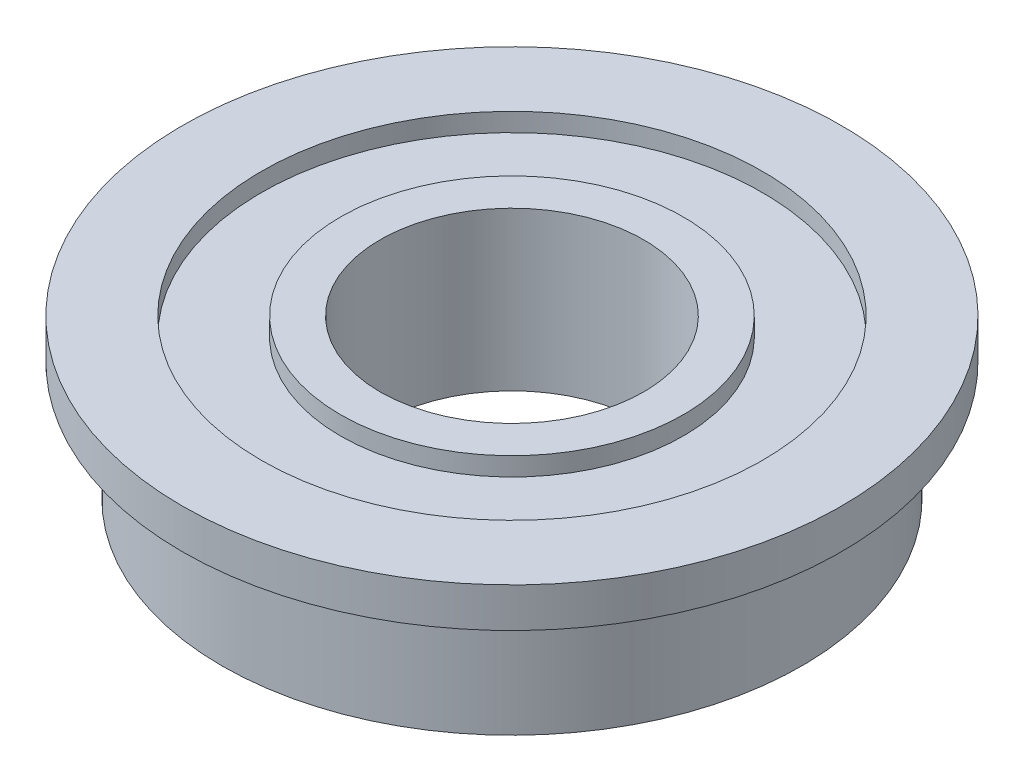
ISO-10303-21;
HEADER;
FILE_DESCRIPTION(('STEP AP214'),'2;1');
FILE_NAME('part.step','',(''),(''),'','','');
FILE_SCHEMA(('AUTOMOTIVE_DESIGN { 1 0 10303 214 1 1 1 1 }'));
ENDSEC;
DATA;
#1=APPLICATION_CONTEXT('core data for automotive mechanical design processes');
#2=APPLICATION_PROTOCOL_DEFINITION('international standard','automotive_design',2000,#1);
#3=PRODUCT_CONTEXT('',#1,'mechanical');
#4=PRODUCT('Part','Part','',(#3));
#5=PRODUCT_RELATED_PRODUCT_CATEGORY('part','',(#4));
#6=PRODUCT_DEFINITION_FORMATION('','',#4);
#7=PRODUCT_DEFINITION_CONTEXT('part definition',#1,'design');
#8=PRODUCT_DEFINITION('design','',#6,#7);
#9=PRODUCT_DEFINITION_SHAPE('','',#8);
#10=(LENGTH_UNIT() NAMED_UNIT(*) SI_UNIT(.MILLI.,.METRE.));
#11=(NAMED_UNIT(*) PLANE_ANGLE_UNIT() SI_UNIT($,.RADIAN.));
#12=(NAMED_UNIT(*) SI_UNIT($,.STERADIAN.) SOLID_ANGLE_UNIT());
#13=UNCERTAINTY_MEASURE_WITH_UNIT(LENGTH_MEASURE(1.E-05),#10,'distance_accuracy_value','');
#14=(GEOMETRIC_REPRESENTATION_CONTEXT(3) GLOBAL_UNCERTAINTY_ASSIGNED_CONTEXT((#13)) GLOBAL_UNIT_ASSIGNED_CONTEXT((#10,
#11,#12)) REPRESENTATION_CONTEXT('',''));
#15=CARTESIAN_POINT('',(0.,0.,0.));
#16=DIRECTION('',(0.,0.,1.));
#17=DIRECTION('',(1.,0.,0.));
#18=AXIS2_PLACEMENT_3D('',#15,#16,#17);
#19=CARTESIAN_POINT('',(0.,4.61129603751149,0.));
#20=DIRECTION('',(0.,1.,0.));
#21=DIRECTION('',(0.,0.,1.));
#22=AXIS2_PLACEMENT_3D('',#19,#20,#21);
#23=CYLINDRICAL_SURFACE('',#22,11.);
#24=CARTESIAN_POINT('',(0.,0.,0.));
#25=DIRECTION('',(0.,1.,0.));
#26=DIRECTION('',(0.,0.,1.));
#27=AXIS2_PLACEMENT_3D('',#24,#25,#26);
#28=CIRCLE('',#27,11.);
#29=CARTESIAN_POINT('',(0.,0.,11.));
#30=VERTEX_POINT('',#29);
#31=EDGE_CURVE('E66',#30,#30,#28,.T.);
#32=ORIENTED_EDGE('',*,*,#31,.T.);
#33=EDGE_LOOP('',(#32));
#34=FACE_BOUND('',#33,.T.);
#35=CARTESIAN_POINT('',(0.,4.5,0.));
#36=DIRECTION('',(0.,1.,0.));
#37=DIRECTION('',(0.,0.,1.));
#38=AXIS2_PLACEMENT_3D('',#35,#36,#37);
#39=CIRCLE('',#38,11.);
#40=CARTESIAN_POINT('',(0.,4.5,11.));
#41=VERTEX_POINT('',#40);
#42=EDGE_CURVE('E10',#41,#41,#39,.T.);
#43=ORIENTED_EDGE('',*,*,#42,.F.);
#44=EDGE_LOOP('',(#43));
#45=FACE_BOUND('',#44,.T.);
#46=ADVANCED_FACE('F37',(#34,#45),#23,.T.);
#47=CARTESIAN_POINT('',(6.5,6.,0.));
#48=DIRECTION('',(0.,-1.,0.));
#49=DIRECTION('',(0.,0.,-1.));
#50=AXIS2_PLACEMENT_3D('',#47,#48,#49);
#51=PLANE('',#50);
#52=CARTESIAN_POINT('',(0.,6.,0.));
#53=DIRECTION('',(0.,1.,0.));
#54=DIRECTION('',(0.,0.,1.));
#55=AXIS2_PLACEMENT_3D('',#52,#53,#54);
#56=CIRCLE('',#55,5.);
#57=CARTESIAN_POINT('',(0.,6.,5.));
#58=VERTEX_POINT('',#57);
#59=EDGE_CURVE('E44',#58,#58,#56,.T.);
#60=ORIENTED_EDGE('',*,*,#59,.F.);
#61=EDGE_LOOP('',(#60));
#62=FACE_BOUND('',#61,.T.);
#63=CARTESIAN_POINT('',(0.,6.,0.));
#64=DIRECTION('',(0.,1.,0.));
#65=DIRECTION('',(0.,0.,1.));
#66=AXIS2_PLACEMENT_3D('',#63,#64,#65);
#67=CIRCLE('',#66,6.5);
#68=CARTESIAN_POINT('',(0.,6.,6.5));
#69=VERTEX_POINT('',#68);
#70=EDGE_CURVE('E78',#69,#69,#67,.T.);
#71=ORIENTED_EDGE('',*,*,#70,.T.);
#72=EDGE_LOOP('',(#71));
#73=FACE_BOUND('',#72,.T.);
#74=ADVANCED_FACE('F39',(#62,#73),#51,.F.);
#75=CARTESIAN_POINT('',(0.,4.61129603751149,0.));
#76=DIRECTION('',(0.,1.,0.));
#77=DIRECTION('',(0.,0.,1.));
#78=AXIS2_PLACEMENT_3D('',#75,#76,#77);
#79=CYLINDRICAL_SURFACE('',#78,5.);
#80=CARTESIAN_POINT('',(0.,0.,0.));
#81=DIRECTION('',(0.,1.,0.));
#82=DIRECTION('',(0.,0.,1.));
#83=AXIS2_PLACEMENT_3D('',#80,#81,#82);
#84=CIRCLE('',#83,5.);
#85=CARTESIAN_POINT('',(0.,0.,5.));
#86=VERTEX_POINT('',#85);
#87=EDGE_CURVE('E48',#86,#86,#84,.T.);
#88=ORIENTED_EDGE('',*,*,#87,.F.);
#89=EDGE_LOOP('',(#88));
#90=FACE_BOUND('',#89,.T.);
#91=ORIENTED_EDGE('',*,*,#59,.T.);
#92=EDGE_LOOP('',(#91));
#93=FACE_BOUND('',#92,.T.);
#94=ADVANCED_FACE('F105',(#90,#93),#79,.F.);
#95=CARTESIAN_POINT('',(5.,0.,0.));
#96=DIRECTION('',(0.,1.,0.));
#97=DIRECTION('',(0.,0.,1.));
#98=AXIS2_PLACEMENT_3D('',#95,#96,#97);
#99=PLANE('',#98);
#100=CARTESIAN_POINT('',(0.,0.,0.));
#101=DIRECTION('',(0.,1.,0.));
#102=DIRECTION('',(0.,0.,1.));
#103=AXIS2_PLACEMENT_3D('',#100,#101,#102);
#104=CIRCLE('',#103,6.5);
#105=CARTESIAN_POINT('',(0.,0.,6.5));
#106=VERTEX_POINT('',#105);
#107=EDGE_CURVE('E52',#106,#106,#104,.T.);
#108=ORIENTED_EDGE('',*,*,#107,.F.);
#109=EDGE_LOOP('',(#108));
#110=FACE_BOUND('',#109,.T.);
#111=ORIENTED_EDGE('',*,*,#87,.T.);
#112=EDGE_LOOP('',(#111));
#113=FACE_BOUND('',#112,.T.);
#114=ADVANCED_FACE('F127',(#110,#113),#99,.F.);
#115=CARTESIAN_POINT('',(0.,4.61129603751149,0.));
#116=DIRECTION('',(0.,1.,0.));
#117=DIRECTION('',(0.,0.,1.));
#118=AXIS2_PLACEMENT_3D('',#115,#116,#117);
#119=CYLINDRICAL_SURFACE('',#118,6.5);
#120=CARTESIAN_POINT('',(0.,0.7,0.));
#121=DIRECTION('',(0.,1.,0.));
#122=DIRECTION('',(0.,0.,1.));
#123=AXIS2_PLACEMENT_3D('',#120,#121,#122);
#124=CIRCLE('',#123,6.5);
#125=CARTESIAN_POINT('',(0.,0.7,6.5));
#126=VERTEX_POINT('',#125);
#127=EDGE_CURVE('E57',#126,#126,#124,.T.);
#128=ORIENTED_EDGE('',*,*,#127,.F.);
#129=EDGE_LOOP('',(#128));
#130=FACE_BOUND('',#129,.T.);
#131=ORIENTED_EDGE('',*,*,#107,.T.);
#132=EDGE_LOOP('',(#131));
#133=FACE_BOUND('',#132,.T.);
#134=ADVANCED_FACE('F123',(#130,#133),#119,.T.);
#135=CARTESIAN_POINT('',(6.5,0.7,0.));
#136=DIRECTION('',(0.,1.,0.));
#137=DIRECTION('',(0.,0.,1.));
#138=AXIS2_PLACEMENT_3D('',#135,#136,#137);
#139=PLANE('',#138);
#140=CARTESIAN_POINT('',(0.,0.7,0.));
#141=DIRECTION('',(0.,1.,0.));
#142=DIRECTION('',(0.,0.,1.));
#143=AXIS2_PLACEMENT_3D('',#140,#141,#142);
#144=CIRCLE('',#143,9.5);
#145=CARTESIAN_POINT('',(0.,0.7,9.5));
#146=VERTEX_POINT('',#145);
#147=EDGE_CURVE('E60',#146,#146,#144,.T.);
#148=ORIENTED_EDGE('',*,*,#147,.F.);
#149=EDGE_LOOP('',(#148));
#150=FACE_BOUND('',#149,.T.);
#151=ORIENTED_EDGE('',*,*,#127,.T.);
#152=EDGE_LOOP('',(#151));
#153=FACE_BOUND('',#152,.T.);
#154=ADVANCED_FACE('F119',(#150,#153),#139,.F.);
#155=CARTESIAN_POINT('',(0.,4.61129603751149,0.));
#156=DIRECTION('',(0.,1.,0.));
#157=DIRECTION('',(0.,0.,1.));
#158=AXIS2_PLACEMENT_3D('',#155,#156,#157);
#159=CYLINDRICAL_SURFACE('',#158,9.5);
#160=CARTESIAN_POINT('',(0.,0.,0.));
#161=DIRECTION('',(0.,1.,0.));
#162=DIRECTION('',(0.,0.,1.));
#163=AXIS2_PLACEMENT_3D('',#160,#161,#162);
#164=CIRCLE('',#163,9.5);
#165=CARTESIAN_POINT('',(0.,0.,9.5));
#166=VERTEX_POINT('',#165);
#167=EDGE_CURVE('E63',#166,#166,#164,.T.);
#168=ORIENTED_EDGE('',*,*,#167,.F.);
#169=EDGE_LOOP('',(#168));
#170=FACE_BOUND('',#169,.T.);
#171=ORIENTED_EDGE('',*,*,#147,.T.);
#172=EDGE_LOOP('',(#171));
#173=FACE_BOUND('',#172,.T.);
#174=ADVANCED_FACE('F115',(#170,#173),#159,.F.);
#175=CARTESIAN_POINT('',(9.5,0.,0.));
#176=DIRECTION('',(0.,1.,0.));
#177=DIRECTION('',(0.,0.,1.));
#178=AXIS2_PLACEMENT_3D('',#175,#176,#177);
#179=PLANE('',#178);
#180=ORIENTED_EDGE('',*,*,#31,.F.);
#181=EDGE_LOOP('',(#180));
#182=FACE_BOUND('',#181,.T.);
#183=ORIENTED_EDGE('',*,*,#167,.T.);
#184=EDGE_LOOP('',(#183));
#185=FACE_BOUND('',#184,.T.);
#186=ADVANCED_FACE('F112',(#182,#185),#179,.F.);
#187=CARTESIAN_POINT('',(11.,6.,0.));
#188=DIRECTION('',(0.,-1.,0.));
#189=DIRECTION('',(0.,0.,-1.));
#190=AXIS2_PLACEMENT_3D('',#187,#188,#189);
#191=PLANE('',#190);
#192=CARTESIAN_POINT('',(0.,6.,0.));
#193=DIRECTION('',(0.,1.,0.));
#194=DIRECTION('',(0.,0.,1.));
#195=AXIS2_PLACEMENT_3D('',#192,#193,#194);
#196=CIRCLE('',#195,9.5);
#197=CARTESIAN_POINT('',(0.,6.,9.5));
#198=VERTEX_POINT('',#197);
#199=EDGE_CURVE('E69',#198,#198,#196,.T.);
#200=ORIENTED_EDGE('',*,*,#199,.F.);
#201=EDGE_LOOP('',(#200));
#202=FACE_BOUND('',#201,.T.);
#203=CARTESIAN_POINT('',(0.,6.,0.));
#204=DIRECTION('',(0.,1.,0.));
#205=DIRECTION('',(0.,0.,1.));
#206=AXIS2_PLACEMENT_3D('',#203,#204,#205);
#207=CIRCLE('',#206,12.5);
#208=CARTESIAN_POINT('',(0.,6.,12.5));
#209=VERTEX_POINT('',#208);
#210=EDGE_CURVE('E82',#209,#209,#207,.T.);
#211=ORIENTED_EDGE('',*,*,#210,.T.);
#212=EDGE_LOOP('',(#211));
#213=FACE_BOUND('',#212,.T.);
#214=ADVANCED_FACE('F110',(#202,#213),#191,.F.);
#215=CARTESIAN_POINT('',(0.,4.61129603751149,0.));
#216=DIRECTION('',(0.,1.,0.));
#217=DIRECTION('',(0.,0.,1.));
#218=AXIS2_PLACEMENT_3D('',#215,#216,#217);
#219=CYLINDRICAL_SURFACE('',#218,9.5);
#220=CARTESIAN_POINT('',(0.,5.3,0.));
#221=DIRECTION('',(0.,1.,0.));
#222=DIRECTION('',(0.,0.,1.));
#223=AXIS2_PLACEMENT_3D('',#220,#221,#222);
#224=CIRCLE('',#223,9.5);
#225=CARTESIAN_POINT('',(0.,5.3,9.5));
#226=VERTEX_POINT('',#225);
#227=EDGE_CURVE('E72',#226,#226,#224,.T.);
#228=ORIENTED_EDGE('',*,*,#227,.F.);
#229=EDGE_LOOP('',(#228));
#230=FACE_BOUND('',#229,.T.);
#231=ORIENTED_EDGE('',*,*,#199,.T.);
#232=EDGE_LOOP('',(#231));
#233=FACE_BOUND('',#232,.T.);
#234=ADVANCED_FACE('F167',(#230,#233),#219,.F.);
#235=CARTESIAN_POINT('',(9.5,5.3,0.));
#236=DIRECTION('',(0.,-1.,0.));
#237=DIRECTION('',(0.,0.,-1.));
#238=AXIS2_PLACEMENT_3D('',#235,#236,#237);
#239=PLANE('',#238);
#240=CARTESIAN_POINT('',(0.,5.3,0.));
#241=DIRECTION('',(0.,1.,0.));
#242=DIRECTION('',(0.,0.,1.));
#243=AXIS2_PLACEMENT_3D('',#240,#241,#242);
#244=CIRCLE('',#243,6.5);
#245=CARTESIAN_POINT('',(0.,5.3,6.5));
#246=VERTEX_POINT('',#245);
#247=EDGE_CURVE('E75',#246,#246,#244,.T.);
#248=ORIENTED_EDGE('',*,*,#247,.F.);
#249=EDGE_LOOP('',(#248));
#250=FACE_BOUND('',#249,.T.);
#251=ORIENTED_EDGE('',*,*,#227,.T.);
#252=EDGE_LOOP('',(#251));
#253=FACE_BOUND('',#252,.T.);
#254=ADVANCED_FACE('F174',(#250,#253),#239,.F.);
#255=CARTESIAN_POINT('',(0.,4.61129603751149,0.));
#256=DIRECTION('',(0.,1.,0.));
#257=DIRECTION('',(0.,0.,1.));
#258=AXIS2_PLACEMENT_3D('',#255,#256,#257);
#259=CYLINDRICAL_SURFACE('',#258,6.5);
#260=ORIENTED_EDGE('',*,*,#70,.F.);
#261=EDGE_LOOP('',(#260));
#262=FACE_BOUND('',#261,.T.);
#263=ORIENTED_EDGE('',*,*,#247,.T.);
#264=EDGE_LOOP('',(#263));
#265=FACE_BOUND('',#264,.T.);
#266=ADVANCED_FACE('F97',(#262,#265),#259,.T.);
#267=CARTESIAN_POINT('',(0.,4.5,0.));
#268=DIRECTION('',(0.,1.,0.));
#269=DIRECTION('',(0.,0.,1.));
#270=AXIS2_PLACEMENT_3D('',#267,#268,#269);
#271=CYLINDRICAL_SURFACE('',#270,12.5);
#272=CARTESIAN_POINT('',(0.,4.5,0.));
#273=DIRECTION('',(0.,1.,0.));
#274=DIRECTION('',(0.,0.,1.));
#275=AXIS2_PLACEMENT_3D('',#272,#273,#274);
#276=CIRCLE('',#275,12.5);
#277=CARTESIAN_POINT('',(0.,4.5,12.5));
#278=VERTEX_POINT('',#277);
#279=EDGE_CURVE('E81',#278,#278,#276,.T.);
#280=ORIENTED_EDGE('',*,*,#279,.T.);
#281=EDGE_LOOP('',(#280));
#282=FACE_BOUND('',#281,.T.);
#283=ORIENTED_EDGE('',*,*,#210,.F.);
#284=EDGE_LOOP('',(#283));
#285=FACE_BOUND('',#284,.T.);
#286=ADVANCED_FACE('F88',(#282,#285),#271,.T.);
#287=CARTESIAN_POINT('',(0.,4.5,0.));
#288=DIRECTION('',(0.,1.,0.));
#289=DIRECTION('',(0.,0.,1.));
#290=AXIS2_PLACEMENT_3D('',#287,#288,#289);
#291=PLANE('',#290);
#292=ORIENTED_EDGE('',*,*,#42,.T.);
#293=EDGE_LOOP('',(#292));
#294=FACE_BOUND('',#293,.T.);
#295=ORIENTED_EDGE('',*,*,#279,.F.);
#296=EDGE_LOOP('',(#295));
#297=FACE_BOUND('',#296,.T.);
#298=ADVANCED_FACE('F91',(#294,#297),#291,.F.);
#299=CLOSED_SHELL('',(#46,#74,#94,#114,#134,#154,#174,#186,#214,#234,#254,#266,#286,#298));
#300=MANIFOLD_SOLID_BREP('B2',#299);
#301=ADVANCED_BREP_SHAPE_REPRESENTATION('',(#18,#300),#14);
#302=SHAPE_DEFINITION_REPRESENTATION(#9,#301);
ENDSEC;
END-ISO-10303-21;
